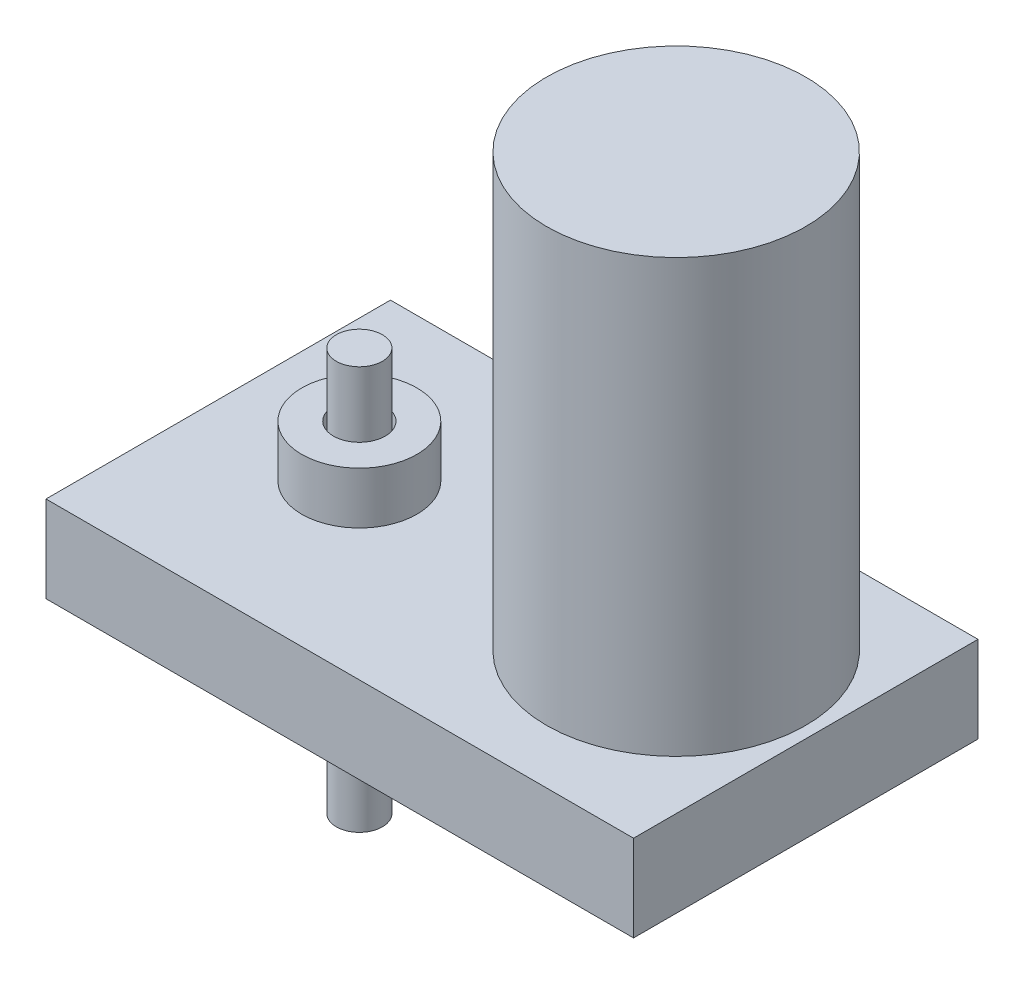
ISO-10303-21;
HEADER;
FILE_DESCRIPTION(('STEP AP214'),'2;1');
FILE_NAME('part.step','',(''),(''),'','','');
FILE_SCHEMA(('AUTOMOTIVE_DESIGN { 1 0 10303 214 1 1 1 1 }'));
ENDSEC;
DATA;
#1=APPLICATION_CONTEXT('core data for automotive mechanical design processes');
#2=APPLICATION_PROTOCOL_DEFINITION('international standard','automotive_design',2000,#1);
#3=PRODUCT_CONTEXT('',#1,'mechanical');
#4=PRODUCT('Part','Part','',(#3));
#5=PRODUCT_RELATED_PRODUCT_CATEGORY('part','',(#4));
#6=PRODUCT_DEFINITION_FORMATION('','',#4);
#7=PRODUCT_DEFINITION_CONTEXT('part definition',#1,'design');
#8=PRODUCT_DEFINITION('design','',#6,#7);
#9=PRODUCT_DEFINITION_SHAPE('','',#8);
#10=(LENGTH_UNIT() NAMED_UNIT(*) SI_UNIT(.MILLI.,.METRE.));
#11=(NAMED_UNIT(*) PLANE_ANGLE_UNIT() SI_UNIT($,.RADIAN.));
#12=(NAMED_UNIT(*) SI_UNIT($,.STERADIAN.) SOLID_ANGLE_UNIT());
#13=UNCERTAINTY_MEASURE_WITH_UNIT(LENGTH_MEASURE(1.E-05),#10,'distance_accuracy_value','');
#14=(GEOMETRIC_REPRESENTATION_CONTEXT(3) GLOBAL_UNCERTAINTY_ASSIGNED_CONTEXT((#13)) GLOBAL_UNIT_ASSIGNED_CONTEXT((#10,
#11,#12)) REPRESENTATION_CONTEXT('',''));
#15=CARTESIAN_POINT('',(0.,0.,0.));
#16=DIRECTION('',(0.,0.,1.));
#17=DIRECTION('',(1.,0.,0.));
#18=AXIS2_PLACEMENT_3D('',#15,#16,#17);
#19=CARTESIAN_POINT('',(-26.5,-35.,0.));
#20=DIRECTION('',(0.,1.,0.));
#21=DIRECTION('',(0.,0.,1.));
#22=AXIS2_PLACEMENT_3D('',#19,#20,#21);
#23=CYLINDRICAL_SURFACE('',#22,4.);
#24=CARTESIAN_POINT('',(-26.5,-35.,0.));
#25=DIRECTION('',(0.,-1.,0.));
#26=DIRECTION('',(0.,0.,-1.));
#27=AXIS2_PLACEMENT_3D('',#24,#25,#26);
#28=CIRCLE('',#27,4.);
#29=CARTESIAN_POINT('',(-26.5,-35.,-4.));
#30=VERTEX_POINT('',#29);
#31=EDGE_CURVE('E11',#30,#30,#28,.T.);
#32=ORIENTED_EDGE('',*,*,#31,.F.);
#33=EDGE_LOOP('',(#32));
#34=FACE_BOUND('',#33,.T.);
#35=CARTESIAN_POINT('',(-26.5,0.,0.));
#36=DIRECTION('',(0.,-1.,0.));
#37=DIRECTION('',(0.,0.,-1.));
#38=AXIS2_PLACEMENT_3D('',#35,#36,#37);
#39=CIRCLE('',#38,4.);
#40=CARTESIAN_POINT('',(-26.5,0.,-4.));
#41=VERTEX_POINT('',#40);
#42=EDGE_CURVE('E49',#41,#41,#39,.T.);
#43=ORIENTED_EDGE('',*,*,#42,.T.);
#44=EDGE_LOOP('',(#43));
#45=FACE_BOUND('',#44,.T.);
#46=ADVANCED_FACE('F46',(#34,#45),#23,.T.);
#47=CARTESIAN_POINT('',(-26.5,-35.,0.));
#48=DIRECTION('',(0.,-1.,0.));
#49=DIRECTION('',(0.,0.,-1.));
#50=AXIS2_PLACEMENT_3D('',#47,#48,#49);
#51=PLANE('',#50);
#52=ORIENTED_EDGE('',*,*,#31,.T.);
#53=EDGE_LOOP('',(#52));
#54=FACE_BOUND('',#53,.T.);
#55=ADVANCED_FACE('F61',(#54),#51,.T.);
#56=CARTESIAN_POINT('',(-26.5,0.,0.));
#57=DIRECTION('',(0.,-1.,0.));
#58=DIRECTION('',(0.,0.,-1.));
#59=AXIS2_PLACEMENT_3D('',#56,#57,#58);
#60=PLANE('',#59);
#61=ORIENTED_EDGE('',*,*,#42,.F.);
#62=EDGE_LOOP('',(#61));
#63=FACE_BOUND('',#62,.T.);
#64=ADVANCED_FACE('F59',(#63),#60,.F.);
#65=CLOSED_SHELL('',(#46,#55,#64));
#66=MANIFOLD_SOLID_BREP('B2',#65);
#67=CARTESIAN_POINT('',(-26.5,35.,0.));
#68=DIRECTION('',(0.,-1.,0.));
#69=DIRECTION('',(0.,0.,-1.));
#70=AXIS2_PLACEMENT_3D('',#67,#68,#69);
#71=CYLINDRICAL_SURFACE('',#70,4.);
#72=CARTESIAN_POINT('',(-26.5,35.,0.));
#73=DIRECTION('',(0.,1.,0.));
#74=DIRECTION('',(0.,0.,1.));
#75=AXIS2_PLACEMENT_3D('',#72,#73,#74);
#76=CIRCLE('',#75,4.);
#77=CARTESIAN_POINT('',(-26.5,35.,4.));
#78=VERTEX_POINT('',#77);
#79=EDGE_CURVE('E45',#78,#78,#76,.T.);
#80=ORIENTED_EDGE('',*,*,#79,.F.);
#81=EDGE_LOOP('',(#80));
#82=FACE_BOUND('',#81,.T.);
#83=CARTESIAN_POINT('',(-26.5,15.,0.));
#84=DIRECTION('',(0.,1.,0.));
#85=DIRECTION('',(0.,0.,1.));
#86=AXIS2_PLACEMENT_3D('',#83,#84,#85);
#87=CIRCLE('',#86,4.);
#88=CARTESIAN_POINT('',(-26.5,15.,4.));
#89=VERTEX_POINT('',#88);
#90=EDGE_CURVE('E99',#89,#89,#87,.T.);
#91=ORIENTED_EDGE('',*,*,#90,.T.);
#92=EDGE_LOOP('',(#91));
#93=FACE_BOUND('',#92,.T.);
#94=ADVANCED_FACE('F96',(#82,#93),#71,.T.);
#95=CARTESIAN_POINT('',(-26.5,35.,0.));
#96=DIRECTION('',(0.,1.,0.));
#97=DIRECTION('',(0.,0.,1.));
#98=AXIS2_PLACEMENT_3D('',#95,#96,#97);
#99=PLANE('',#98);
#100=ORIENTED_EDGE('',*,*,#79,.T.);
#101=EDGE_LOOP('',(#100));
#102=FACE_BOUND('',#101,.T.);
#103=ADVANCED_FACE('F111',(#102),#99,.T.);
#104=CARTESIAN_POINT('',(-26.5,15.,0.));
#105=DIRECTION('',(0.,1.,0.));
#106=DIRECTION('',(0.,0.,1.));
#107=AXIS2_PLACEMENT_3D('',#104,#105,#106);
#108=PLANE('',#107);
#109=ORIENTED_EDGE('',*,*,#90,.F.);
#110=EDGE_LOOP('',(#109));
#111=FACE_BOUND('',#110,.T.);
#112=ADVANCED_FACE('F109',(#111),#108,.F.);
#113=CLOSED_SHELL('',(#94,#103,#112));
#114=MANIFOLD_SOLID_BREP('B6',#113);
#115=CARTESIAN_POINT('',(0.,0.,0.));
#116=DIRECTION('',(0.,1.,0.));
#117=DIRECTION('',(0.,0.,1.));
#118=AXIS2_PLACEMENT_3D('',#115,#116,#117);
#119=PLANE('',#118);
#120=CARTESIAN_POINT('',(-26.5,0.,0.));
#121=DIRECTION('',(0.,1.,0.));
#122=DIRECTION('',(0.,0.,1.));
#123=AXIS2_PLACEMENT_3D('',#120,#121,#122);
#124=CIRCLE('',#123,4.);
#125=CARTESIAN_POINT('',(-26.5,0.,4.));
#126=VERTEX_POINT('',#125);
#127=EDGE_CURVE('E212',#126,#126,#124,.T.);
#128=ORIENTED_EDGE('',*,*,#127,.T.);
#129=EDGE_LOOP('',(#128));
#130=FACE_BOUND('',#129,.T.);
#131=CARTESIAN_POINT('',(-26.5,0.,0.));
#132=DIRECTION('',(0.,-1.,0.));
#133=DIRECTION('',(0.,0.,-1.));
#134=AXIS2_PLACEMENT_3D('',#131,#132,#133);
#135=CIRCLE('',#134,4.5);
#136=CARTESIAN_POINT('',(-26.5,0.,-4.5));
#137=VERTEX_POINT('',#136);
#138=EDGE_CURVE('E248',#137,#137,#135,.T.);
#139=ORIENTED_EDGE('',*,*,#138,.T.);
#140=EDGE_LOOP('',(#139));
#141=FACE_BOUND('',#140,.T.);
#142=ADVANCED_FACE('F137',(#130,#141),#119,.F.);
#143=CARTESIAN_POINT('',(0.,15.,-29.9));
#144=DIRECTION('',(0.,0.,-1.));
#145=DIRECTION('',(-1.,0.,0.));
#146=AXIS2_PLACEMENT_3D('',#143,#144,#145);
#147=PLANE('',#146);
#148=DIRECTION('',(1.,0.,0.));
#149=VECTOR('',#148,1.);
#150=CARTESIAN_POINT('',(0.,0.,-29.9));
#151=LINE('',#150,#149);
#152=CARTESIAN_POINT('',(-51.,0.,-29.9));
#153=VERTEX_POINT('',#152);
#154=CARTESIAN_POINT('',(51.,0.,-29.9));
#155=VERTEX_POINT('',#154);
#156=EDGE_CURVE('E210',#153,#155,#151,.T.);
#157=ORIENTED_EDGE('',*,*,#156,.F.);
#158=DIRECTION('',(0.,-1.,0.));
#159=VECTOR('',#158,1.);
#160=CARTESIAN_POINT('',(-51.,15.,-29.9));
#161=LINE('',#160,#159);
#162=CARTESIAN_POINT('',(-51.,15.,-29.9));
#163=VERTEX_POINT('',#162);
#164=EDGE_CURVE('E146',#163,#153,#161,.T.);
#165=ORIENTED_EDGE('',*,*,#164,.F.);
#166=DIRECTION('',(1.,0.,0.));
#167=VECTOR('',#166,1.);
#168=CARTESIAN_POINT('',(0.,15.,-29.9));
#169=LINE('',#168,#167);
#170=CARTESIAN_POINT('',(51.,15.,-29.9));
#171=VERTEX_POINT('',#170);
#172=EDGE_CURVE('E194',#163,#171,#169,.T.);
#173=ORIENTED_EDGE('',*,*,#172,.T.);
#174=DIRECTION('',(0.,-1.,0.));
#175=VECTOR('',#174,1.);
#176=CARTESIAN_POINT('',(51.,15.,-29.9));
#177=LINE('',#176,#175);
#178=EDGE_CURVE('E154',#171,#155,#177,.T.);
#179=ORIENTED_EDGE('',*,*,#178,.T.);
#180=EDGE_LOOP('',(#157,#165,#173,#179));
#181=FACE_BOUND('',#180,.T.);
#182=ADVANCED_FACE('F274',(#181),#147,.T.);
#183=CARTESIAN_POINT('',(-51.,15.,0.));
#184=DIRECTION('',(1.,0.,0.));
#185=DIRECTION('',(0.,0.,-1.));
#186=AXIS2_PLACEMENT_3D('',#183,#184,#185);
#187=PLANE('',#186);
#188=DIRECTION('',(0.,0.,1.));
#189=VECTOR('',#188,1.);
#190=CARTESIAN_POINT('',(-51.,0.,0.));
#191=LINE('',#190,#189);
#192=CARTESIAN_POINT('',(-51.,0.,29.9));
#193=VERTEX_POINT('',#192);
#194=EDGE_CURVE('E199',#153,#193,#191,.T.);
#195=ORIENTED_EDGE('',*,*,#194,.T.);
#196=DIRECTION('',(0.,-1.,0.));
#197=VECTOR('',#196,1.);
#198=CARTESIAN_POINT('',(-51.,15.,29.9));
#199=LINE('',#198,#197);
#200=CARTESIAN_POINT('',(-51.,15.,29.9));
#201=VERTEX_POINT('',#200);
#202=EDGE_CURVE('E185',#201,#193,#199,.T.);
#203=ORIENTED_EDGE('',*,*,#202,.F.);
#204=DIRECTION('',(0.,0.,1.));
#205=VECTOR('',#204,1.);
#206=CARTESIAN_POINT('',(-51.,15.,0.));
#207=LINE('',#206,#205);
#208=EDGE_CURVE('E190',#163,#201,#207,.T.);
#209=ORIENTED_EDGE('',*,*,#208,.F.);
#210=ORIENTED_EDGE('',*,*,#164,.T.);
#211=EDGE_LOOP('',(#195,#203,#209,#210));
#212=FACE_BOUND('',#211,.T.);
#213=ADVANCED_FACE('F197',(#212),#187,.F.);
#214=CARTESIAN_POINT('',(0.,15.,29.9));
#215=DIRECTION('',(0.,0.,-1.));
#216=DIRECTION('',(-1.,0.,0.));
#217=AXIS2_PLACEMENT_3D('',#214,#215,#216);
#218=PLANE('',#217);
#219=DIRECTION('',(1.,0.,0.));
#220=VECTOR('',#219,1.);
#221=CARTESIAN_POINT('',(0.,0.,29.9));
#222=LINE('',#221,#220);
#223=CARTESIAN_POINT('',(51.,0.,29.9));
#224=VERTEX_POINT('',#223);
#225=EDGE_CURVE('E207',#193,#224,#222,.T.);
#226=ORIENTED_EDGE('',*,*,#225,.T.);
#227=DIRECTION('',(0.,-1.,0.));
#228=VECTOR('',#227,1.);
#229=CARTESIAN_POINT('',(51.,15.,29.9));
#230=LINE('',#229,#228);
#231=CARTESIAN_POINT('',(51.,15.,29.9));
#232=VERTEX_POINT('',#231);
#233=EDGE_CURVE('E169',#232,#224,#230,.T.);
#234=ORIENTED_EDGE('',*,*,#233,.F.);
#235=DIRECTION('',(1.,0.,0.));
#236=VECTOR('',#235,1.);
#237=CARTESIAN_POINT('',(0.,15.,29.9));
#238=LINE('',#237,#236);
#239=EDGE_CURVE('E181',#201,#232,#238,.T.);
#240=ORIENTED_EDGE('',*,*,#239,.F.);
#241=ORIENTED_EDGE('',*,*,#202,.T.);
#242=EDGE_LOOP('',(#226,#234,#240,#241));
#243=FACE_BOUND('',#242,.T.);
#244=ADVANCED_FACE('F183',(#243),#218,.F.);
#245=CARTESIAN_POINT('',(-26.5,15.,0.));
#246=DIRECTION('',(0.,-1.,0.));
#247=DIRECTION('',(0.,0.,-1.));
#248=AXIS2_PLACEMENT_3D('',#245,#246,#247);
#249=CYLINDRICAL_SURFACE('',#248,4.);
#250=CARTESIAN_POINT('',(-26.5,15.,0.));
#251=DIRECTION('',(0.,1.,0.));
#252=DIRECTION('',(0.,0.,1.));
#253=AXIS2_PLACEMENT_3D('',#250,#251,#252);
#254=CIRCLE('',#253,4.);
#255=CARTESIAN_POINT('',(-26.5,15.,4.));
#256=VERTEX_POINT('',#255);
#257=EDGE_CURVE('E230',#256,#256,#254,.T.);
#258=ORIENTED_EDGE('',*,*,#257,.T.);
#259=EDGE_LOOP('',(#258));
#260=FACE_BOUND('',#259,.T.);
#261=ORIENTED_EDGE('',*,*,#127,.F.);
#262=EDGE_LOOP('',(#261));
#263=FACE_BOUND('',#262,.T.);
#264=ADVANCED_FACE('F139',(#260,#263),#249,.F.);
#265=CARTESIAN_POINT('',(51.,15.,0.));
#266=DIRECTION('',(1.,0.,0.));
#267=DIRECTION('',(0.,0.,-1.));
#268=AXIS2_PLACEMENT_3D('',#265,#266,#267);
#269=PLANE('',#268);
#270=DIRECTION('',(0.,0.,1.));
#271=VECTOR('',#270,1.);
#272=CARTESIAN_POINT('',(51.,0.,0.));
#273=LINE('',#272,#271);
#274=EDGE_CURVE('E204',#155,#224,#273,.T.);
#275=ORIENTED_EDGE('',*,*,#274,.F.);
#276=ORIENTED_EDGE('',*,*,#178,.F.);
#277=DIRECTION('',(0.,0.,1.));
#278=VECTOR('',#277,1.);
#279=CARTESIAN_POINT('',(51.,15.,0.));
#280=LINE('',#279,#278);
#281=EDGE_CURVE('E189',#171,#232,#280,.T.);
#282=ORIENTED_EDGE('',*,*,#281,.T.);
#283=ORIENTED_EDGE('',*,*,#233,.T.);
#284=EDGE_LOOP('',(#275,#276,#282,#283));
#285=FACE_BOUND('',#284,.T.);
#286=ADVANCED_FACE('F294',(#285),#269,.T.);
#287=CARTESIAN_POINT('',(0.,15.,0.));
#288=DIRECTION('',(0.,1.,0.));
#289=DIRECTION('',(0.,0.,1.));
#290=AXIS2_PLACEMENT_3D('',#287,#288,#289);
#291=PLANE('',#290);
#292=CARTESIAN_POINT('',(-26.5,15.,0.));
#293=DIRECTION('',(0.,1.,0.));
#294=DIRECTION('',(0.,0.,1.));
#295=AXIS2_PLACEMENT_3D('',#292,#293,#294);
#296=CIRCLE('',#295,10.);
#297=CARTESIAN_POINT('',(-26.5,15.,10.));
#298=VERTEX_POINT('',#297);
#299=EDGE_CURVE('E233',#298,#298,#296,.T.);
#300=ORIENTED_EDGE('',*,*,#299,.F.);
#301=EDGE_LOOP('',(#300));
#302=FACE_BOUND('',#301,.T.);
#303=CARTESIAN_POINT('',(28.5,15.,0.));
#304=DIRECTION('',(0.,1.,0.));
#305=DIRECTION('',(0.,0.,1.));
#306=AXIS2_PLACEMENT_3D('',#303,#304,#305);
#307=CIRCLE('',#306,5.);
#308=CARTESIAN_POINT('',(28.5,15.,5.));
#309=VERTEX_POINT('',#308);
#310=EDGE_CURVE('E218',#309,#309,#307,.T.);
#311=ORIENTED_EDGE('',*,*,#310,.F.);
#312=EDGE_LOOP('',(#311));
#313=FACE_BOUND('',#312,.T.);
#314=ORIENTED_EDGE('',*,*,#172,.F.);
#315=ORIENTED_EDGE('',*,*,#208,.T.);
#316=ORIENTED_EDGE('',*,*,#239,.T.);
#317=ORIENTED_EDGE('',*,*,#281,.F.);
#318=EDGE_LOOP('',(#314,#315,#316,#317));
#319=FACE_BOUND('',#318,.T.);
#320=ADVANCED_FACE('F193',(#302,#313,#319),#291,.T.);
#321=CARTESIAN_POINT('',(-26.5,0.,0.));
#322=DIRECTION('',(0.,1.,0.));
#323=DIRECTION('',(0.,0.,1.));
#324=AXIS2_PLACEMENT_3D('',#321,#322,#323);
#325=CIRCLE('',#324,10.);
#326=CARTESIAN_POINT('',(-26.5,0.,10.));
#327=VERTEX_POINT('',#326);
#328=EDGE_CURVE('E94',#327,#327,#325,.F.);
#329=ORIENTED_EDGE('',*,*,#328,.F.);
#330=EDGE_LOOP('',(#329));
#331=FACE_BOUND('',#330,.T.);
#332=ORIENTED_EDGE('',*,*,#156,.T.);
#333=ORIENTED_EDGE('',*,*,#274,.T.);
#334=ORIENTED_EDGE('',*,*,#225,.F.);
#335=ORIENTED_EDGE('',*,*,#194,.F.);
#336=EDGE_LOOP('',(#332,#333,#334,#335));
#337=FACE_BOUND('',#336,.T.);
#338=ADVANCED_FACE('F277',(#331,#337),#119,.F.);
#339=CARTESIAN_POINT('',(28.5,17.,0.));
#340=DIRECTION('',(0.,-1.,0.));
#341=DIRECTION('',(0.,0.,-1.));
#342=AXIS2_PLACEMENT_3D('',#339,#340,#341);
#343=CYLINDRICAL_SURFACE('',#342,5.);
#344=CARTESIAN_POINT('',(28.5,17.,0.));
#345=DIRECTION('',(0.,1.,0.));
#346=DIRECTION('',(0.,0.,1.));
#347=AXIS2_PLACEMENT_3D('',#344,#345,#346);
#348=CIRCLE('',#347,5.);
#349=CARTESIAN_POINT('',(28.5,17.,5.));
#350=VERTEX_POINT('',#349);
#351=EDGE_CURVE('E215',#350,#350,#348,.T.);
#352=ORIENTED_EDGE('',*,*,#351,.F.);
#353=EDGE_LOOP('',(#352));
#354=FACE_BOUND('',#353,.T.);
#355=ORIENTED_EDGE('',*,*,#310,.T.);
#356=EDGE_LOOP('',(#355));
#357=FACE_BOUND('',#356,.T.);
#358=ADVANCED_FACE('F285',(#354,#357),#343,.T.);
#359=CARTESIAN_POINT('',(28.5,92.,0.));
#360=DIRECTION('',(0.,-1.,0.));
#361=DIRECTION('',(0.,0.,-1.));
#362=AXIS2_PLACEMENT_3D('',#359,#360,#361);
#363=CYLINDRICAL_SURFACE('',#362,22.5);
#364=CARTESIAN_POINT('',(28.5,92.,0.));
#365=DIRECTION('',(0.,1.,0.));
#366=DIRECTION('',(0.,0.,1.));
#367=AXIS2_PLACEMENT_3D('',#364,#365,#366);
#368=CIRCLE('',#367,22.5);
#369=CARTESIAN_POINT('',(28.5,92.,22.5));
#370=VERTEX_POINT('',#369);
#371=EDGE_CURVE('E221',#370,#370,#368,.T.);
#372=ORIENTED_EDGE('',*,*,#371,.F.);
#373=EDGE_LOOP('',(#372));
#374=FACE_BOUND('',#373,.T.);
#375=CARTESIAN_POINT('',(28.5,17.,0.));
#376=DIRECTION('',(0.,1.,0.));
#377=DIRECTION('',(0.,0.,1.));
#378=AXIS2_PLACEMENT_3D('',#375,#376,#377);
#379=CIRCLE('',#378,22.5);
#380=CARTESIAN_POINT('',(28.5,17.,22.5));
#381=VERTEX_POINT('',#380);
#382=EDGE_CURVE('E224',#381,#381,#379,.T.);
#383=ORIENTED_EDGE('',*,*,#382,.T.);
#384=EDGE_LOOP('',(#383));
#385=FACE_BOUND('',#384,.T.);
#386=ADVANCED_FACE('F291',(#374,#385),#363,.T.);
#387=CARTESIAN_POINT('',(28.5,92.,0.));
#388=DIRECTION('',(0.,1.,0.));
#389=DIRECTION('',(0.,0.,1.));
#390=AXIS2_PLACEMENT_3D('',#387,#388,#389);
#391=PLANE('',#390);
#392=ORIENTED_EDGE('',*,*,#371,.T.);
#393=EDGE_LOOP('',(#392));
#394=FACE_BOUND('',#393,.T.);
#395=ADVANCED_FACE('F340',(#394),#391,.T.);
#396=CARTESIAN_POINT('',(28.5,17.,0.));
#397=DIRECTION('',(0.,1.,0.));
#398=DIRECTION('',(0.,0.,1.));
#399=AXIS2_PLACEMENT_3D('',#396,#397,#398);
#400=PLANE('',#399);
#401=ORIENTED_EDGE('',*,*,#351,.T.);
#402=EDGE_LOOP('',(#401));
#403=FACE_BOUND('',#402,.T.);
#404=ORIENTED_EDGE('',*,*,#382,.F.);
#405=EDGE_LOOP('',(#404));
#406=FACE_BOUND('',#405,.T.);
#407=ADVANCED_FACE('F350',(#403,#406),#400,.F.);
#408=CARTESIAN_POINT('',(-26.5,24.,0.));
#409=DIRECTION('',(0.,1.,0.));
#410=DIRECTION('',(0.,0.,1.));
#411=AXIS2_PLACEMENT_3D('',#408,#409,#410);
#412=PLANE('',#411);
#413=CARTESIAN_POINT('',(-26.5,24.,0.));
#414=DIRECTION('',(0.,1.,0.));
#415=DIRECTION('',(0.,0.,1.));
#416=AXIS2_PLACEMENT_3D('',#413,#414,#415);
#417=CIRCLE('',#416,4.5);
#418=CARTESIAN_POINT('',(-26.5,24.,4.5));
#419=VERTEX_POINT('',#418);
#420=EDGE_CURVE('E239',#419,#419,#417,.T.);
#421=ORIENTED_EDGE('',*,*,#420,.F.);
#422=EDGE_LOOP('',(#421));
#423=FACE_BOUND('',#422,.T.);
#424=CARTESIAN_POINT('',(-26.5,24.,0.));
#425=DIRECTION('',(0.,1.,0.));
#426=DIRECTION('',(0.,0.,1.));
#427=AXIS2_PLACEMENT_3D('',#424,#425,#426);
#428=CIRCLE('',#427,10.);
#429=CARTESIAN_POINT('',(-26.5,24.,10.));
#430=VERTEX_POINT('',#429);
#431=EDGE_CURVE('E227',#430,#430,#428,.T.);
#432=ORIENTED_EDGE('',*,*,#431,.T.);
#433=EDGE_LOOP('',(#432));
#434=FACE_BOUND('',#433,.T.);
#435=ADVANCED_FACE('F360',(#423,#434),#412,.T.);
#436=CARTESIAN_POINT('',(-26.5,24.,0.));
#437=DIRECTION('',(0.,-1.,0.));
#438=DIRECTION('',(0.,0.,-1.));
#439=AXIS2_PLACEMENT_3D('',#436,#437,#438);
#440=CYLINDRICAL_SURFACE('',#439,10.);
#441=ORIENTED_EDGE('',*,*,#431,.F.);
#442=EDGE_LOOP('',(#441));
#443=FACE_BOUND('',#442,.T.);
#444=ORIENTED_EDGE('',*,*,#299,.T.);
#445=EDGE_LOOP('',(#444));
#446=FACE_BOUND('',#445,.T.);
#447=ADVANCED_FACE('F373',(#443,#446),#440,.T.);
#448=CARTESIAN_POINT('',(-26.5,15.,0.));
#449=DIRECTION('',(0.,1.,0.));
#450=DIRECTION('',(0.,0.,1.));
#451=AXIS2_PLACEMENT_3D('',#448,#449,#450);
#452=CYLINDRICAL_SURFACE('',#451,4.5);
#453=CARTESIAN_POINT('',(-26.5,15.,0.));
#454=DIRECTION('',(0.,1.,0.));
#455=DIRECTION('',(0.,0.,1.));
#456=AXIS2_PLACEMENT_3D('',#453,#454,#455);
#457=CIRCLE('',#456,4.5);
#458=CARTESIAN_POINT('',(-26.5,15.,4.5));
#459=VERTEX_POINT('',#458);
#460=EDGE_CURVE('E234',#459,#459,#457,.T.);
#461=ORIENTED_EDGE('',*,*,#460,.F.);
#462=EDGE_LOOP('',(#461));
#463=FACE_BOUND('',#462,.T.);
#464=ORIENTED_EDGE('',*,*,#420,.T.);
#465=EDGE_LOOP('',(#464));
#466=FACE_BOUND('',#465,.T.);
#467=ADVANCED_FACE('F269',(#463,#466),#452,.F.);
#468=CARTESIAN_POINT('',(-26.5,15.,0.));
#469=DIRECTION('',(0.,1.,0.));
#470=DIRECTION('',(0.,0.,1.));
#471=AXIS2_PLACEMENT_3D('',#468,#469,#470);
#472=PLANE('',#471);
#473=ORIENTED_EDGE('',*,*,#257,.F.);
#474=EDGE_LOOP('',(#473));
#475=FACE_BOUND('',#474,.T.);
#476=ORIENTED_EDGE('',*,*,#460,.T.);
#477=EDGE_LOOP('',(#476));
#478=FACE_BOUND('',#477,.T.);
#479=ADVANCED_FACE('F260',(#475,#478),#472,.T.);
#480=CARTESIAN_POINT('',(-26.5,-10.,0.));
#481=DIRECTION('',(0.,-1.,0.));
#482=DIRECTION('',(0.,0.,-1.));
#483=AXIS2_PLACEMENT_3D('',#480,#481,#482);
#484=PLANE('',#483);
#485=CARTESIAN_POINT('',(-26.5,-10.,0.));
#486=DIRECTION('',(0.,-1.,0.));
#487=DIRECTION('',(0.,0.,-1.));
#488=AXIS2_PLACEMENT_3D('',#485,#486,#487);
#489=CIRCLE('',#488,10.);
#490=CARTESIAN_POINT('',(-26.5,-10.,-10.));
#491=VERTEX_POINT('',#490);
#492=EDGE_CURVE('E242',#491,#491,#489,.T.);
#493=ORIENTED_EDGE('',*,*,#492,.T.);
#494=EDGE_LOOP('',(#493));
#495=FACE_BOUND('',#494,.T.);
#496=CARTESIAN_POINT('',(-26.5,-10.,0.));
#497=DIRECTION('',(0.,-1.,0.));
#498=DIRECTION('',(0.,0.,-1.));
#499=AXIS2_PLACEMENT_3D('',#496,#497,#498);
#500=CIRCLE('',#499,4.5);
#501=CARTESIAN_POINT('',(-26.5,-10.,-4.5));
#502=VERTEX_POINT('',#501);
#503=EDGE_CURVE('E247',#502,#502,#500,.T.);
#504=ORIENTED_EDGE('',*,*,#503,.F.);
#505=EDGE_LOOP('',(#504));
#506=FACE_BOUND('',#505,.T.);
#507=ADVANCED_FACE('F257',(#495,#506),#484,.T.);
#508=CARTESIAN_POINT('',(-26.5,-10.,0.));
#509=DIRECTION('',(0.,1.,0.));
#510=DIRECTION('',(0.,0.,1.));
#511=AXIS2_PLACEMENT_3D('',#508,#509,#510);
#512=CYLINDRICAL_SURFACE('',#511,10.);
#513=ORIENTED_EDGE('',*,*,#492,.F.);
#514=EDGE_LOOP('',(#513));
#515=FACE_BOUND('',#514,.T.);
#516=ORIENTED_EDGE('',*,*,#328,.T.);
#517=EDGE_LOOP('',(#516));
#518=FACE_BOUND('',#517,.T.);
#519=ADVANCED_FACE('F259',(#515,#518),#512,.T.);
#520=CARTESIAN_POINT('',(-26.5,-10.,0.));
#521=DIRECTION('',(0.,1.,0.));
#522=DIRECTION('',(0.,0.,1.));
#523=AXIS2_PLACEMENT_3D('',#520,#521,#522);
#524=CYLINDRICAL_SURFACE('',#523,4.5);
#525=ORIENTED_EDGE('',*,*,#503,.T.);
#526=EDGE_LOOP('',(#525));
#527=FACE_BOUND('',#526,.T.);
#528=ORIENTED_EDGE('',*,*,#138,.F.);
#529=EDGE_LOOP('',(#528));
#530=FACE_BOUND('',#529,.T.);
#531=ADVANCED_FACE('F254',(#527,#530),#524,.F.);
#532=CLOSED_SHELL('',(#142,#182,#213,#244,#264,#286,#320,#338,#358,#386,#395,#407,#435,#447,
#467,#479,#507,#519,#531));
#533=MANIFOLD_SOLID_BREP('B40',#532);
#534=ADVANCED_BREP_SHAPE_REPRESENTATION('',(#18,#66,#114,#533),#14);
#535=SHAPE_DEFINITION_REPRESENTATION(#9,#534);
ENDSEC;
END-ISO-10303-21;
